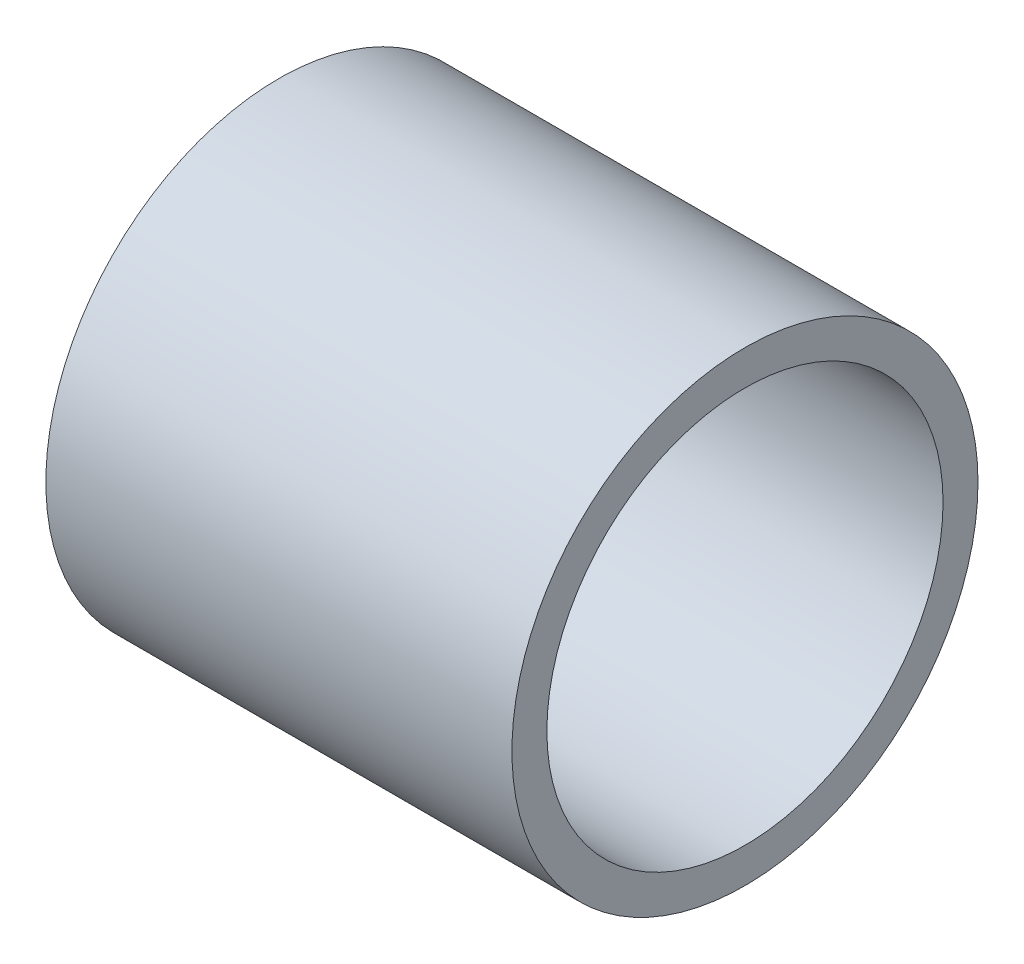
ISO-10303-21;
HEADER;
FILE_DESCRIPTION(('STEP AP214'),'2;1');
FILE_NAME('part.step','',(''),(''),'','','');
FILE_SCHEMA(('AUTOMOTIVE_DESIGN { 1 0 10303 214 1 1 1 1 }'));
ENDSEC;
DATA;
#1=APPLICATION_CONTEXT('core data for automotive mechanical design processes');
#2=APPLICATION_PROTOCOL_DEFINITION('international standard','automotive_design',2000,#1);
#3=PRODUCT_CONTEXT('',#1,'mechanical');
#4=PRODUCT('Part','Part','',(#3));
#5=PRODUCT_RELATED_PRODUCT_CATEGORY('part','',(#4));
#6=PRODUCT_DEFINITION_FORMATION('','',#4);
#7=PRODUCT_DEFINITION_CONTEXT('part definition',#1,'design');
#8=PRODUCT_DEFINITION('design','',#6,#7);
#9=PRODUCT_DEFINITION_SHAPE('','',#8);
#10=(LENGTH_UNIT() NAMED_UNIT(*) SI_UNIT(.MILLI.,.METRE.));
#11=(NAMED_UNIT(*) PLANE_ANGLE_UNIT() SI_UNIT($,.RADIAN.));
#12=(NAMED_UNIT(*) SI_UNIT($,.STERADIAN.) SOLID_ANGLE_UNIT());
#13=UNCERTAINTY_MEASURE_WITH_UNIT(LENGTH_MEASURE(1.E-05),#10,'distance_accuracy_value','');
#14=(GEOMETRIC_REPRESENTATION_CONTEXT(3) GLOBAL_UNCERTAINTY_ASSIGNED_CONTEXT((#13)) GLOBAL_UNIT_ASSIGNED_CONTEXT((#10,
#11,#12)) REPRESENTATION_CONTEXT('',''));
#15=CARTESIAN_POINT('',(0.,0.,0.));
#16=DIRECTION('',(0.,0.,1.));
#17=DIRECTION('',(1.,0.,0.));
#18=AXIS2_PLACEMENT_3D('',#15,#16,#17);
#19=CARTESIAN_POINT('',(20.,0.,0.));
#20=DIRECTION('',(1.,0.,0.));
#21=DIRECTION('',(0.,0.,-1.));
#22=AXIS2_PLACEMENT_3D('',#19,#20,#21);
#23=PLANE('',#22);
#24=CARTESIAN_POINT('',(20.,0.,0.));
#25=DIRECTION('',(1.,0.,0.));
#26=DIRECTION('',(0.,0.,-1.));
#27=AXIS2_PLACEMENT_3D('',#24,#25,#26);
#28=CIRCLE('',#27,10.);
#29=CARTESIAN_POINT('',(20.,0.,-10.));
#30=VERTEX_POINT('',#29);
#31=EDGE_CURVE('E10',#30,#30,#28,.T.);
#32=ORIENTED_EDGE('',*,*,#31,.T.);
#33=EDGE_LOOP('',(#32));
#34=FACE_BOUND('',#33,.T.);
#35=CARTESIAN_POINT('',(20.,0.,0.));
#36=DIRECTION('',(1.,0.,0.));
#37=DIRECTION('',(0.,0.,-1.));
#38=AXIS2_PLACEMENT_3D('',#35,#36,#37);
#39=CIRCLE('',#38,8.5);
#40=CARTESIAN_POINT('',(20.,0.,-8.5));
#41=VERTEX_POINT('',#40);
#42=EDGE_CURVE('E43',#41,#41,#39,.T.);
#43=ORIENTED_EDGE('',*,*,#42,.F.);
#44=EDGE_LOOP('',(#43));
#45=FACE_BOUND('',#44,.T.);
#46=ADVANCED_FACE('F32',(#34,#45),#23,.T.);
#47=CARTESIAN_POINT('',(0.,0.,0.));
#48=DIRECTION('',(1.,0.,0.));
#49=DIRECTION('',(0.,0.,-1.));
#50=AXIS2_PLACEMENT_3D('',#47,#48,#49);
#51=PLANE('',#50);
#52=CARTESIAN_POINT('',(0.,0.,0.));
#53=DIRECTION('',(1.,0.,0.));
#54=DIRECTION('',(0.,0.,-1.));
#55=AXIS2_PLACEMENT_3D('',#52,#53,#54);
#56=CIRCLE('',#55,10.);
#57=CARTESIAN_POINT('',(0.,0.,-10.));
#58=VERTEX_POINT('',#57);
#59=EDGE_CURVE('E36',#58,#58,#56,.T.);
#60=ORIENTED_EDGE('',*,*,#59,.F.);
#61=EDGE_LOOP('',(#60));
#62=FACE_BOUND('',#61,.T.);
#63=CARTESIAN_POINT('',(0.,0.,0.));
#64=DIRECTION('',(1.,0.,0.));
#65=DIRECTION('',(0.,0.,-1.));
#66=AXIS2_PLACEMENT_3D('',#63,#64,#65);
#67=CIRCLE('',#66,8.5);
#68=CARTESIAN_POINT('',(0.,0.,-8.5));
#69=VERTEX_POINT('',#68);
#70=EDGE_CURVE('E45',#69,#69,#67,.T.);
#71=ORIENTED_EDGE('',*,*,#70,.T.);
#72=EDGE_LOOP('',(#71));
#73=FACE_BOUND('',#72,.T.);
#74=ADVANCED_FACE('F55',(#62,#73),#51,.F.);
#75=CARTESIAN_POINT('',(20.,0.,0.));
#76=DIRECTION('',(-1.,0.,0.));
#77=DIRECTION('',(0.,0.,1.));
#78=AXIS2_PLACEMENT_3D('',#75,#76,#77);
#79=CYLINDRICAL_SURFACE('',#78,10.);
#80=ORIENTED_EDGE('',*,*,#31,.F.);
#81=EDGE_LOOP('',(#80));
#82=FACE_BOUND('',#81,.T.);
#83=ORIENTED_EDGE('',*,*,#59,.T.);
#84=EDGE_LOOP('',(#83));
#85=FACE_BOUND('',#84,.T.);
#86=ADVANCED_FACE('F34',(#82,#85),#79,.T.);
#87=CARTESIAN_POINT('',(20.,0.,0.));
#88=DIRECTION('',(-1.,0.,0.));
#89=DIRECTION('',(0.,0.,1.));
#90=AXIS2_PLACEMENT_3D('',#87,#88,#89);
#91=CYLINDRICAL_SURFACE('',#90,8.5);
#92=ORIENTED_EDGE('',*,*,#42,.T.);
#93=EDGE_LOOP('',(#92));
#94=FACE_BOUND('',#93,.T.);
#95=ORIENTED_EDGE('',*,*,#70,.F.);
#96=EDGE_LOOP('',(#95));
#97=FACE_BOUND('',#96,.T.);
#98=ADVANCED_FACE('F51',(#94,#97),#91,.F.);
#99=CLOSED_SHELL('',(#46,#74,#86,#98));
#100=MANIFOLD_SOLID_BREP('B2',#99);
#101=ADVANCED_BREP_SHAPE_REPRESENTATION('',(#18,#100),#14);
#102=SHAPE_DEFINITION_REPRESENTATION(#9,#101);
ENDSEC;
END-ISO-10303-21;
